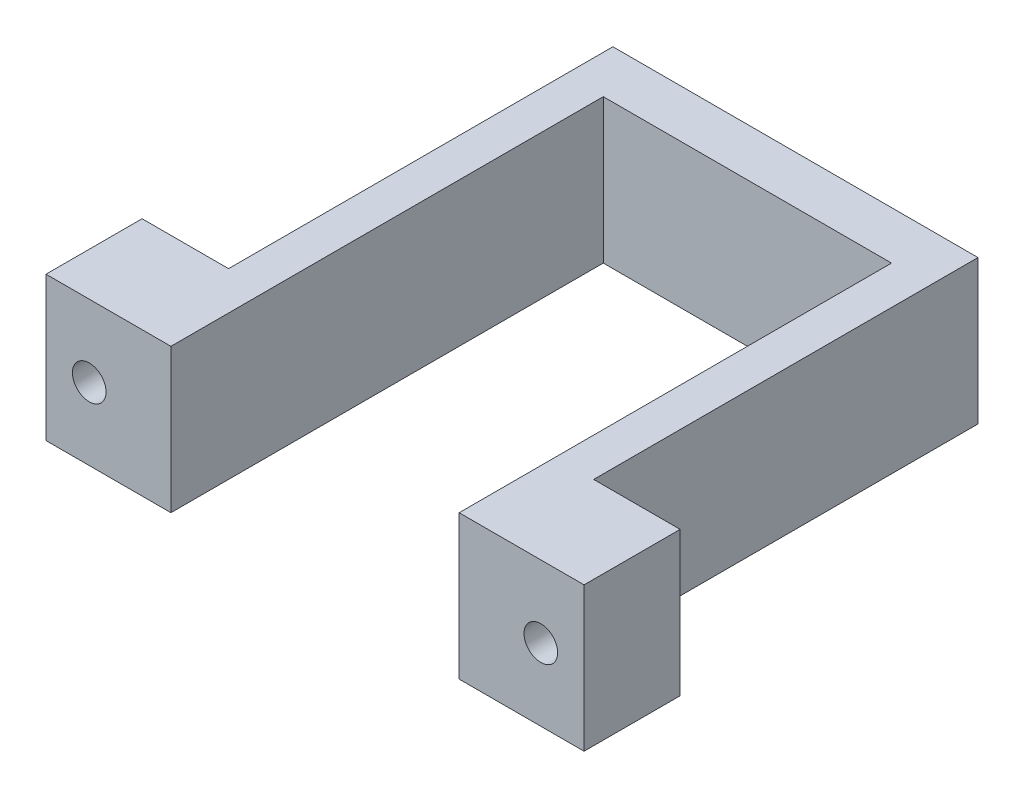
ISO-10303-21;
HEADER;
FILE_DESCRIPTION(('STEP AP214'),'2;1');
FILE_NAME('part.step','',(''),(''),'','','');
FILE_SCHEMA(('AUTOMOTIVE_DESIGN { 1 0 10303 214 1 1 1 1 }'));
ENDSEC;
DATA;
#1=APPLICATION_CONTEXT('core data for automotive mechanical design processes');
#2=APPLICATION_PROTOCOL_DEFINITION('international standard','automotive_design',2000,#1);
#3=PRODUCT_CONTEXT('',#1,'mechanical');
#4=PRODUCT('Part','Part','',(#3));
#5=PRODUCT_RELATED_PRODUCT_CATEGORY('part','',(#4));
#6=PRODUCT_DEFINITION_FORMATION('','',#4);
#7=PRODUCT_DEFINITION_CONTEXT('part definition',#1,'design');
#8=PRODUCT_DEFINITION('design','',#6,#7);
#9=PRODUCT_DEFINITION_SHAPE('','',#8);
#10=(LENGTH_UNIT() NAMED_UNIT(*) SI_UNIT(.MILLI.,.METRE.));
#11=(NAMED_UNIT(*) PLANE_ANGLE_UNIT() SI_UNIT($,.RADIAN.));
#12=(NAMED_UNIT(*) SI_UNIT($,.STERADIAN.) SOLID_ANGLE_UNIT());
#13=UNCERTAINTY_MEASURE_WITH_UNIT(LENGTH_MEASURE(1.E-05),#10,'distance_accuracy_value','');
#14=(GEOMETRIC_REPRESENTATION_CONTEXT(3) GLOBAL_UNCERTAINTY_ASSIGNED_CONTEXT((#13)) GLOBAL_UNIT_ASSIGNED_CONTEXT((#10,
#11,#12)) REPRESENTATION_CONTEXT('',''));
#15=CARTESIAN_POINT('',(0.,0.,0.));
#16=DIRECTION('',(0.,0.,1.));
#17=DIRECTION('',(1.,0.,0.));
#18=AXIS2_PLACEMENT_3D('',#15,#16,#17);
#19=CARTESIAN_POINT('',(-15.,15.,0.));
#20=DIRECTION('',(0.,0.,-1.));
#21=DIRECTION('',(-1.,0.,0.));
#22=AXIS2_PLACEMENT_3D('',#19,#20,#21);
#23=PLANE('',#22);
#24=CARTESIAN_POINT('',(-23.5,7.5,0.));
#25=DIRECTION('',(0.,0.,-1.));
#26=DIRECTION('',(-1.,0.,0.));
#27=AXIS2_PLACEMENT_3D('',#24,#25,#26);
#28=CIRCLE('',#27,1.75);
#29=CARTESIAN_POINT('',(-25.25,7.5,0.));
#30=VERTEX_POINT('',#29);
#31=EDGE_CURVE('E261',#30,#30,#28,.T.);
#32=ORIENTED_EDGE('',*,*,#31,.T.);
#33=EDGE_LOOP('',(#32));
#34=FACE_BOUND('',#33,.T.);
#35=DIRECTION('',(1.,0.,0.));
#36=VECTOR('',#35,1.);
#37=CARTESIAN_POINT('',(-15.,0.,0.));
#38=LINE('',#37,#36);
#39=CARTESIAN_POINT('',(-28.,0.,0.));
#40=VERTEX_POINT('',#39);
#41=CARTESIAN_POINT('',(-15.,0.,0.));
#42=VERTEX_POINT('',#41);
#43=EDGE_CURVE('E152',#40,#42,#38,.T.);
#44=ORIENTED_EDGE('',*,*,#43,.T.);
#45=DIRECTION('',(0.,-1.,0.));
#46=VECTOR('',#45,1.);
#47=CARTESIAN_POINT('',(-15.,15.,0.));
#48=LINE('',#47,#46);
#49=CARTESIAN_POINT('',(-15.,15.,0.));
#50=VERTEX_POINT('',#49);
#51=EDGE_CURVE('E11',#50,#42,#48,.T.);
#52=ORIENTED_EDGE('',*,*,#51,.F.);
#53=DIRECTION('',(1.,0.,0.));
#54=VECTOR('',#53,1.);
#55=CARTESIAN_POINT('',(-15.,15.,0.));
#56=LINE('',#55,#54);
#57=CARTESIAN_POINT('',(-28.,15.,0.));
#58=VERTEX_POINT('',#57);
#59=EDGE_CURVE('E175',#58,#50,#56,.T.);
#60=ORIENTED_EDGE('',*,*,#59,.F.);
#61=DIRECTION('',(0.,-1.,0.));
#62=VECTOR('',#61,1.);
#63=CARTESIAN_POINT('',(-28.,15.,0.));
#64=LINE('',#63,#62);
#65=EDGE_CURVE('E148',#58,#40,#64,.T.);
#66=ORIENTED_EDGE('',*,*,#65,.T.);
#67=EDGE_LOOP('',(#44,#52,#60,#66));
#68=FACE_BOUND('',#67,.T.);
#69=ADVANCED_FACE('F32',(#34,#68),#23,.F.);
#70=CARTESIAN_POINT('',(-15.,15.,-45.));
#71=DIRECTION('',(-1.,0.,0.));
#72=DIRECTION('',(0.,0.,1.));
#73=AXIS2_PLACEMENT_3D('',#70,#71,#72);
#74=PLANE('',#73);
#75=DIRECTION('',(0.,0.,-1.));
#76=VECTOR('',#75,1.);
#77=CARTESIAN_POINT('',(-15.,0.,-45.));
#78=LINE('',#77,#76);
#79=CARTESIAN_POINT('',(-15.,0.,-45.));
#80=VERTEX_POINT('',#79);
#81=EDGE_CURVE('E155',#42,#80,#78,.T.);
#82=ORIENTED_EDGE('',*,*,#81,.T.);
#83=DIRECTION('',(0.,-1.,0.));
#84=VECTOR('',#83,1.);
#85=CARTESIAN_POINT('',(-15.,15.,-45.));
#86=LINE('',#85,#84);
#87=CARTESIAN_POINT('',(-15.,15.,-45.));
#88=VERTEX_POINT('',#87);
#89=EDGE_CURVE('E40',#88,#80,#86,.T.);
#90=ORIENTED_EDGE('',*,*,#89,.F.);
#91=DIRECTION('',(0.,0.,-1.));
#92=VECTOR('',#91,1.);
#93=CARTESIAN_POINT('',(-15.,15.,-45.));
#94=LINE('',#93,#92);
#95=EDGE_CURVE('E103',#50,#88,#94,.T.);
#96=ORIENTED_EDGE('',*,*,#95,.F.);
#97=ORIENTED_EDGE('',*,*,#51,.T.);
#98=EDGE_LOOP('',(#82,#90,#96,#97));
#99=FACE_BOUND('',#98,.T.);
#100=ADVANCED_FACE('F254',(#99),#74,.F.);
#101=CARTESIAN_POINT('',(15.,15.,-45.));
#102=DIRECTION('',(0.,0.,-1.));
#103=DIRECTION('',(-1.,0.,0.));
#104=AXIS2_PLACEMENT_3D('',#101,#102,#103);
#105=PLANE('',#104);
#106=DIRECTION('',(1.,0.,0.));
#107=VECTOR('',#106,1.);
#108=CARTESIAN_POINT('',(15.,0.,-45.));
#109=LINE('',#108,#107);
#110=CARTESIAN_POINT('',(15.,0.,-45.));
#111=VERTEX_POINT('',#110);
#112=EDGE_CURVE('E158',#80,#111,#109,.T.);
#113=ORIENTED_EDGE('',*,*,#112,.T.);
#114=DIRECTION('',(0.,-1.,0.));
#115=VECTOR('',#114,1.);
#116=CARTESIAN_POINT('',(15.,15.,-45.));
#117=LINE('',#116,#115);
#118=CARTESIAN_POINT('',(15.,15.,-45.));
#119=VERTEX_POINT('',#118);
#120=EDGE_CURVE('E194',#119,#111,#117,.T.);
#121=ORIENTED_EDGE('',*,*,#120,.F.);
#122=DIRECTION('',(1.,0.,0.));
#123=VECTOR('',#122,1.);
#124=CARTESIAN_POINT('',(15.,15.,-45.));
#125=LINE('',#124,#123);
#126=EDGE_CURVE('E202',#88,#119,#125,.T.);
#127=ORIENTED_EDGE('',*,*,#126,.F.);
#128=ORIENTED_EDGE('',*,*,#89,.T.);
#129=EDGE_LOOP('',(#113,#121,#127,#128));
#130=FACE_BOUND('',#129,.T.);
#131=ADVANCED_FACE('F200',(#130),#105,.F.);
#132=CARTESIAN_POINT('',(15.,15.,0.));
#133=DIRECTION('',(1.,0.,0.));
#134=DIRECTION('',(0.,0.,-1.));
#135=AXIS2_PLACEMENT_3D('',#132,#133,#134);
#136=PLANE('',#135);
#137=DIRECTION('',(0.,0.,1.));
#138=VECTOR('',#137,1.);
#139=CARTESIAN_POINT('',(15.,0.,0.));
#140=LINE('',#139,#138);
#141=CARTESIAN_POINT('',(15.,0.,0.));
#142=VERTEX_POINT('',#141);
#143=EDGE_CURVE('E160',#111,#142,#140,.T.);
#144=ORIENTED_EDGE('',*,*,#143,.T.);
#145=DIRECTION('',(0.,-1.,0.));
#146=VECTOR('',#145,1.);
#147=CARTESIAN_POINT('',(15.,15.,0.));
#148=LINE('',#147,#146);
#149=CARTESIAN_POINT('',(15.,15.,0.));
#150=VERTEX_POINT('',#149);
#151=EDGE_CURVE('E191',#150,#142,#148,.T.);
#152=ORIENTED_EDGE('',*,*,#151,.F.);
#153=DIRECTION('',(0.,0.,1.));
#154=VECTOR('',#153,1.);
#155=CARTESIAN_POINT('',(15.,15.,0.));
#156=LINE('',#155,#154);
#157=EDGE_CURVE('E220',#119,#150,#156,.T.);
#158=ORIENTED_EDGE('',*,*,#157,.F.);
#159=ORIENTED_EDGE('',*,*,#120,.T.);
#160=EDGE_LOOP('',(#144,#152,#158,#159));
#161=FACE_BOUND('',#160,.T.);
#162=ADVANCED_FACE('F211',(#161),#136,.F.);
#163=CARTESIAN_POINT('',(28.,15.,0.));
#164=DIRECTION('',(0.,0.,-1.));
#165=DIRECTION('',(-1.,0.,0.));
#166=AXIS2_PLACEMENT_3D('',#163,#164,#165);
#167=PLANE('',#166);
#168=CARTESIAN_POINT('',(23.5,7.5,0.));
#169=DIRECTION('',(0.,0.,-1.));
#170=DIRECTION('',(-1.,0.,0.));
#171=AXIS2_PLACEMENT_3D('',#168,#169,#170);
#172=CIRCLE('',#171,1.75);
#173=CARTESIAN_POINT('',(21.75,7.5,0.));
#174=VERTEX_POINT('',#173);
#175=EDGE_CURVE('E156',#174,#174,#172,.T.);
#176=ORIENTED_EDGE('',*,*,#175,.T.);
#177=EDGE_LOOP('',(#176));
#178=FACE_BOUND('',#177,.T.);
#179=DIRECTION('',(1.,0.,0.));
#180=VECTOR('',#179,1.);
#181=CARTESIAN_POINT('',(28.,0.,0.));
#182=LINE('',#181,#180);
#183=CARTESIAN_POINT('',(28.,0.,0.));
#184=VERTEX_POINT('',#183);
#185=EDGE_CURVE('E162',#142,#184,#182,.T.);
#186=ORIENTED_EDGE('',*,*,#185,.T.);
#187=DIRECTION('',(0.,-1.,0.));
#188=VECTOR('',#187,1.);
#189=CARTESIAN_POINT('',(28.,15.,0.));
#190=LINE('',#189,#188);
#191=CARTESIAN_POINT('',(28.,15.,0.));
#192=VERTEX_POINT('',#191);
#193=EDGE_CURVE('E188',#192,#184,#190,.T.);
#194=ORIENTED_EDGE('',*,*,#193,.F.);
#195=DIRECTION('',(1.,0.,0.));
#196=VECTOR('',#195,1.);
#197=CARTESIAN_POINT('',(28.,15.,0.));
#198=LINE('',#197,#196);
#199=EDGE_CURVE('E217',#150,#192,#198,.T.);
#200=ORIENTED_EDGE('',*,*,#199,.F.);
#201=ORIENTED_EDGE('',*,*,#151,.T.);
#202=EDGE_LOOP('',(#186,#194,#200,#201));
#203=FACE_BOUND('',#202,.T.);
#204=ADVANCED_FACE('F215',(#178,#203),#167,.F.);
#205=CARTESIAN_POINT('',(28.,15.,-9.99999999999999));
#206=DIRECTION('',(-1.,0.,0.));
#207=DIRECTION('',(0.,0.,1.));
#208=AXIS2_PLACEMENT_3D('',#205,#206,#207);
#209=PLANE('',#208);
#210=DIRECTION('',(0.,0.,-1.));
#211=VECTOR('',#210,1.);
#212=CARTESIAN_POINT('',(28.,0.,-9.99999999999999));
#213=LINE('',#212,#211);
#214=CARTESIAN_POINT('',(28.,0.,-9.99999999999999));
#215=VERTEX_POINT('',#214);
#216=EDGE_CURVE('E164',#184,#215,#213,.T.);
#217=ORIENTED_EDGE('',*,*,#216,.T.);
#218=DIRECTION('',(0.,-1.,0.));
#219=VECTOR('',#218,1.);
#220=CARTESIAN_POINT('',(28.,15.,-9.99999999999999));
#221=LINE('',#220,#219);
#222=CARTESIAN_POINT('',(28.,15.,-9.99999999999999));
#223=VERTEX_POINT('',#222);
#224=EDGE_CURVE('E185',#223,#215,#221,.T.);
#225=ORIENTED_EDGE('',*,*,#224,.F.);
#226=DIRECTION('',(0.,0.,-1.));
#227=VECTOR('',#226,1.);
#228=CARTESIAN_POINT('',(28.,15.,-9.99999999999999));
#229=LINE('',#228,#227);
#230=EDGE_CURVE('E219',#192,#223,#229,.T.);
#231=ORIENTED_EDGE('',*,*,#230,.F.);
#232=ORIENTED_EDGE('',*,*,#193,.T.);
#233=EDGE_LOOP('',(#217,#225,#231,#232));
#234=FACE_BOUND('',#233,.T.);
#235=ADVANCED_FACE('F287',(#234),#209,.F.);
#236=CARTESIAN_POINT('',(19.,15.,-9.99999999999999));
#237=DIRECTION('',(0.,0.,1.));
#238=DIRECTION('',(1.,0.,0.));
#239=AXIS2_PLACEMENT_3D('',#236,#237,#238);
#240=PLANE('',#239);
#241=CARTESIAN_POINT('',(23.5,7.5,-9.99999999999999));
#242=DIRECTION('',(0.,0.,-1.));
#243=DIRECTION('',(-1.,0.,0.));
#244=AXIS2_PLACEMENT_3D('',#241,#242,#243);
#245=CIRCLE('',#244,1.75);
#246=CARTESIAN_POINT('',(21.75,7.5,-9.99999999999999));
#247=VERTEX_POINT('',#246);
#248=EDGE_CURVE('E263',#247,#247,#245,.T.);
#249=ORIENTED_EDGE('',*,*,#248,.F.);
#250=EDGE_LOOP('',(#249));
#251=FACE_BOUND('',#250,.T.);
#252=DIRECTION('',(-1.,0.,0.));
#253=VECTOR('',#252,1.);
#254=CARTESIAN_POINT('',(19.,0.,-9.99999999999999));
#255=LINE('',#254,#253);
#256=CARTESIAN_POINT('',(19.,0.,-9.99999999999999));
#257=VERTEX_POINT('',#256);
#258=EDGE_CURVE('E166',#215,#257,#255,.T.);
#259=ORIENTED_EDGE('',*,*,#258,.T.);
#260=DIRECTION('',(0.,-1.,0.));
#261=VECTOR('',#260,1.);
#262=CARTESIAN_POINT('',(19.,15.,-9.99999999999999));
#263=LINE('',#262,#261);
#264=CARTESIAN_POINT('',(19.,15.,-9.99999999999999));
#265=VERTEX_POINT('',#264);
#266=EDGE_CURVE('E182',#265,#257,#263,.T.);
#267=ORIENTED_EDGE('',*,*,#266,.F.);
#268=DIRECTION('',(-1.,0.,0.));
#269=VECTOR('',#268,1.);
#270=CARTESIAN_POINT('',(19.,15.,-9.99999999999999));
#271=LINE('',#270,#269);
#272=EDGE_CURVE('E222',#223,#265,#271,.T.);
#273=ORIENTED_EDGE('',*,*,#272,.F.);
#274=ORIENTED_EDGE('',*,*,#224,.T.);
#275=EDGE_LOOP('',(#259,#267,#273,#274));
#276=FACE_BOUND('',#275,.T.);
#277=ADVANCED_FACE('F284',(#251,#276),#240,.F.);
#278=CARTESIAN_POINT('',(19.,15.,-50.));
#279=DIRECTION('',(-1.,0.,0.));
#280=DIRECTION('',(0.,0.,1.));
#281=AXIS2_PLACEMENT_3D('',#278,#279,#280);
#282=PLANE('',#281);
#283=DIRECTION('',(0.,0.,-1.));
#284=VECTOR('',#283,1.);
#285=CARTESIAN_POINT('',(19.,0.,-50.));
#286=LINE('',#285,#284);
#287=CARTESIAN_POINT('',(19.,0.,-50.));
#288=VERTEX_POINT('',#287);
#289=EDGE_CURVE('E168',#257,#288,#286,.T.);
#290=ORIENTED_EDGE('',*,*,#289,.T.);
#291=DIRECTION('',(0.,-1.,0.));
#292=VECTOR('',#291,1.);
#293=CARTESIAN_POINT('',(19.,15.,-50.));
#294=LINE('',#293,#292);
#295=CARTESIAN_POINT('',(19.,15.,-50.));
#296=VERTEX_POINT('',#295);
#297=EDGE_CURVE('E179',#296,#288,#294,.T.);
#298=ORIENTED_EDGE('',*,*,#297,.F.);
#299=DIRECTION('',(0.,0.,-1.));
#300=VECTOR('',#299,1.);
#301=CARTESIAN_POINT('',(19.,15.,-50.));
#302=LINE('',#301,#300);
#303=EDGE_CURVE('E228',#265,#296,#302,.T.);
#304=ORIENTED_EDGE('',*,*,#303,.F.);
#305=ORIENTED_EDGE('',*,*,#266,.T.);
#306=EDGE_LOOP('',(#290,#298,#304,#305));
#307=FACE_BOUND('',#306,.T.);
#308=ADVANCED_FACE('F234',(#307),#282,.F.);
#309=CARTESIAN_POINT('',(-19.,15.,-50.));
#310=DIRECTION('',(0.,0.,1.));
#311=DIRECTION('',(1.,0.,0.));
#312=AXIS2_PLACEMENT_3D('',#309,#310,#311);
#313=PLANE('',#312);
#314=DIRECTION('',(-1.,0.,0.));
#315=VECTOR('',#314,1.);
#316=CARTESIAN_POINT('',(-19.,0.,-50.));
#317=LINE('',#316,#315);
#318=CARTESIAN_POINT('',(-19.,0.,-50.));
#319=VERTEX_POINT('',#318);
#320=EDGE_CURVE('E170',#288,#319,#317,.T.);
#321=ORIENTED_EDGE('',*,*,#320,.T.);
#322=DIRECTION('',(0.,-1.,0.));
#323=VECTOR('',#322,1.);
#324=CARTESIAN_POINT('',(-19.,15.,-50.));
#325=LINE('',#324,#323);
#326=CARTESIAN_POINT('',(-19.,15.,-50.));
#327=VERTEX_POINT('',#326);
#328=EDGE_CURVE('E143',#327,#319,#325,.T.);
#329=ORIENTED_EDGE('',*,*,#328,.F.);
#330=DIRECTION('',(-1.,0.,0.));
#331=VECTOR('',#330,1.);
#332=CARTESIAN_POINT('',(-19.,15.,-50.));
#333=LINE('',#332,#331);
#334=EDGE_CURVE('E134',#296,#327,#333,.T.);
#335=ORIENTED_EDGE('',*,*,#334,.F.);
#336=ORIENTED_EDGE('',*,*,#297,.T.);
#337=EDGE_LOOP('',(#321,#329,#335,#336));
#338=FACE_BOUND('',#337,.T.);
#339=ADVANCED_FACE('F238',(#338),#313,.F.);
#340=CARTESIAN_POINT('',(-19.,15.,-9.99999999999999));
#341=DIRECTION('',(1.,0.,0.));
#342=DIRECTION('',(0.,0.,-1.));
#343=AXIS2_PLACEMENT_3D('',#340,#341,#342);
#344=PLANE('',#343);
#345=DIRECTION('',(0.,0.,1.));
#346=VECTOR('',#345,1.);
#347=CARTESIAN_POINT('',(-19.,0.,-9.99999999999999));
#348=LINE('',#347,#346);
#349=CARTESIAN_POINT('',(-19.,0.,-9.99999999999999));
#350=VERTEX_POINT('',#349);
#351=EDGE_CURVE('E142',#319,#350,#348,.T.);
#352=ORIENTED_EDGE('',*,*,#351,.T.);
#353=DIRECTION('',(0.,-1.,0.));
#354=VECTOR('',#353,1.);
#355=CARTESIAN_POINT('',(-19.,15.,-9.99999999999999));
#356=LINE('',#355,#354);
#357=CARTESIAN_POINT('',(-19.,15.,-9.99999999999999));
#358=VERTEX_POINT('',#357);
#359=EDGE_CURVE('E139',#358,#350,#356,.T.);
#360=ORIENTED_EDGE('',*,*,#359,.F.);
#361=DIRECTION('',(0.,0.,1.));
#362=VECTOR('',#361,1.);
#363=CARTESIAN_POINT('',(-19.,15.,-9.99999999999999));
#364=LINE('',#363,#362);
#365=EDGE_CURVE('E128',#327,#358,#364,.T.);
#366=ORIENTED_EDGE('',*,*,#365,.F.);
#367=ORIENTED_EDGE('',*,*,#328,.T.);
#368=EDGE_LOOP('',(#352,#360,#366,#367));
#369=FACE_BOUND('',#368,.T.);
#370=ADVANCED_FACE('F140',(#369),#344,.F.);
#371=CARTESIAN_POINT('',(-28.,15.,-9.99999999999999));
#372=DIRECTION('',(0.,0.,1.));
#373=DIRECTION('',(1.,0.,0.));
#374=AXIS2_PLACEMENT_3D('',#371,#372,#373);
#375=PLANE('',#374);
#376=CARTESIAN_POINT('',(-23.5,7.5,-9.99999999999999));
#377=DIRECTION('',(0.,0.,-1.));
#378=DIRECTION('',(-1.,0.,0.));
#379=AXIS2_PLACEMENT_3D('',#376,#377,#378);
#380=CIRCLE('',#379,1.75);
#381=CARTESIAN_POINT('',(-25.25,7.5,-9.99999999999999));
#382=VERTEX_POINT('',#381);
#383=EDGE_CURVE('E264',#382,#382,#380,.T.);
#384=ORIENTED_EDGE('',*,*,#383,.F.);
#385=EDGE_LOOP('',(#384));
#386=FACE_BOUND('',#385,.T.);
#387=DIRECTION('',(-1.,0.,0.));
#388=VECTOR('',#387,1.);
#389=CARTESIAN_POINT('',(-28.,0.,-9.99999999999999));
#390=LINE('',#389,#388);
#391=CARTESIAN_POINT('',(-28.,0.,-9.99999999999999));
#392=VERTEX_POINT('',#391);
#393=EDGE_CURVE('E89',#350,#392,#390,.T.);
#394=ORIENTED_EDGE('',*,*,#393,.T.);
#395=DIRECTION('',(0.,-1.,0.));
#396=VECTOR('',#395,1.);
#397=CARTESIAN_POINT('',(-28.,15.,-9.99999999999999));
#398=LINE('',#397,#396);
#399=CARTESIAN_POINT('',(-28.,15.,-9.99999999999999));
#400=VERTEX_POINT('',#399);
#401=EDGE_CURVE('E144',#400,#392,#398,.T.);
#402=ORIENTED_EDGE('',*,*,#401,.F.);
#403=DIRECTION('',(-1.,0.,0.));
#404=VECTOR('',#403,1.);
#405=CARTESIAN_POINT('',(-28.,15.,-9.99999999999999));
#406=LINE('',#405,#404);
#407=EDGE_CURVE('E132',#358,#400,#406,.T.);
#408=ORIENTED_EDGE('',*,*,#407,.F.);
#409=ORIENTED_EDGE('',*,*,#359,.T.);
#410=EDGE_LOOP('',(#394,#402,#408,#409));
#411=FACE_BOUND('',#410,.T.);
#412=ADVANCED_FACE('F146',(#386,#411),#375,.F.);
#413=CARTESIAN_POINT('',(-28.,15.,0.));
#414=DIRECTION('',(1.,0.,0.));
#415=DIRECTION('',(0.,0.,-1.));
#416=AXIS2_PLACEMENT_3D('',#413,#414,#415);
#417=PLANE('',#416);
#418=DIRECTION('',(0.,0.,1.));
#419=VECTOR('',#418,1.);
#420=CARTESIAN_POINT('',(-28.,0.,0.));
#421=LINE('',#420,#419);
#422=EDGE_CURVE('E95',#392,#40,#421,.T.);
#423=ORIENTED_EDGE('',*,*,#422,.T.);
#424=ORIENTED_EDGE('',*,*,#65,.F.);
#425=DIRECTION('',(0.,0.,1.));
#426=VECTOR('',#425,1.);
#427=CARTESIAN_POINT('',(-28.,15.,0.));
#428=LINE('',#427,#426);
#429=EDGE_CURVE('E48',#400,#58,#428,.T.);
#430=ORIENTED_EDGE('',*,*,#429,.F.);
#431=ORIENTED_EDGE('',*,*,#401,.T.);
#432=EDGE_LOOP('',(#423,#424,#430,#431));
#433=FACE_BOUND('',#432,.T.);
#434=ADVANCED_FACE('F242',(#433),#417,.F.);
#435=CARTESIAN_POINT('',(0.,15.,0.));
#436=DIRECTION('',(0.,-1.,0.));
#437=DIRECTION('',(0.,0.,-1.));
#438=AXIS2_PLACEMENT_3D('',#435,#436,#437);
#439=PLANE('',#438);
#440=ORIENTED_EDGE('',*,*,#59,.T.);
#441=ORIENTED_EDGE('',*,*,#95,.T.);
#442=ORIENTED_EDGE('',*,*,#126,.T.);
#443=ORIENTED_EDGE('',*,*,#157,.T.);
#444=ORIENTED_EDGE('',*,*,#199,.T.);
#445=ORIENTED_EDGE('',*,*,#230,.T.);
#446=ORIENTED_EDGE('',*,*,#272,.T.);
#447=ORIENTED_EDGE('',*,*,#303,.T.);
#448=ORIENTED_EDGE('',*,*,#334,.T.);
#449=ORIENTED_EDGE('',*,*,#365,.T.);
#450=ORIENTED_EDGE('',*,*,#407,.T.);
#451=ORIENTED_EDGE('',*,*,#429,.T.);
#452=EDGE_LOOP('',(#440,#441,#442,#443,#444,#445,#446,#447,#448,#449,#450,#451));
#453=FACE_BOUND('',#452,.T.);
#454=ADVANCED_FACE('F130',(#453),#439,.F.);
#455=CARTESIAN_POINT('',(0.,0.,0.));
#456=DIRECTION('',(0.,-1.,0.));
#457=DIRECTION('',(0.,0.,-1.));
#458=AXIS2_PLACEMENT_3D('',#455,#456,#457);
#459=PLANE('',#458);
#460=ORIENTED_EDGE('',*,*,#43,.F.);
#461=ORIENTED_EDGE('',*,*,#422,.F.);
#462=ORIENTED_EDGE('',*,*,#393,.F.);
#463=ORIENTED_EDGE('',*,*,#351,.F.);
#464=ORIENTED_EDGE('',*,*,#320,.F.);
#465=ORIENTED_EDGE('',*,*,#289,.F.);
#466=ORIENTED_EDGE('',*,*,#258,.F.);
#467=ORIENTED_EDGE('',*,*,#216,.F.);
#468=ORIENTED_EDGE('',*,*,#185,.F.);
#469=ORIENTED_EDGE('',*,*,#143,.F.);
#470=ORIENTED_EDGE('',*,*,#112,.F.);
#471=ORIENTED_EDGE('',*,*,#81,.F.);
#472=EDGE_LOOP('',(#460,#461,#462,#463,#464,#465,#466,#467,#468,#469,#470,#471));
#473=FACE_BOUND('',#472,.T.);
#474=ADVANCED_FACE('F206',(#473),#459,.T.);
#475=CARTESIAN_POINT('',(23.5,7.5,0.));
#476=DIRECTION('',(0.,0.,-1.));
#477=DIRECTION('',(-1.,0.,0.));
#478=AXIS2_PLACEMENT_3D('',#475,#476,#477);
#479=CYLINDRICAL_SURFACE('',#478,1.75);
#480=ORIENTED_EDGE('',*,*,#175,.F.);
#481=EDGE_LOOP('',(#480));
#482=FACE_BOUND('',#481,.T.);
#483=ORIENTED_EDGE('',*,*,#248,.T.);
#484=EDGE_LOOP('',(#483));
#485=FACE_BOUND('',#484,.T.);
#486=ADVANCED_FACE('F277',(#482,#485),#479,.F.);
#487=CARTESIAN_POINT('',(-23.5,7.5,0.));
#488=DIRECTION('',(0.,0.,-1.));
#489=DIRECTION('',(-1.,0.,0.));
#490=AXIS2_PLACEMENT_3D('',#487,#488,#489);
#491=CYLINDRICAL_SURFACE('',#490,1.75);
#492=ORIENTED_EDGE('',*,*,#31,.F.);
#493=EDGE_LOOP('',(#492));
#494=FACE_BOUND('',#493,.T.);
#495=ORIENTED_EDGE('',*,*,#383,.T.);
#496=EDGE_LOOP('',(#495));
#497=FACE_BOUND('',#496,.T.);
#498=ADVANCED_FACE('F280',(#494,#497),#491,.F.);
#499=CLOSED_SHELL('',(#69,#100,#131,#162,#204,#235,#277,#308,#339,#370,#412,#434,#454,#474,#486,#498));
#500=MANIFOLD_SOLID_BREP('B2',#499);
#501=ADVANCED_BREP_SHAPE_REPRESENTATION('',(#18,#500),#14);
#502=SHAPE_DEFINITION_REPRESENTATION(#9,#501);
ENDSEC;
END-ISO-10303-21;
